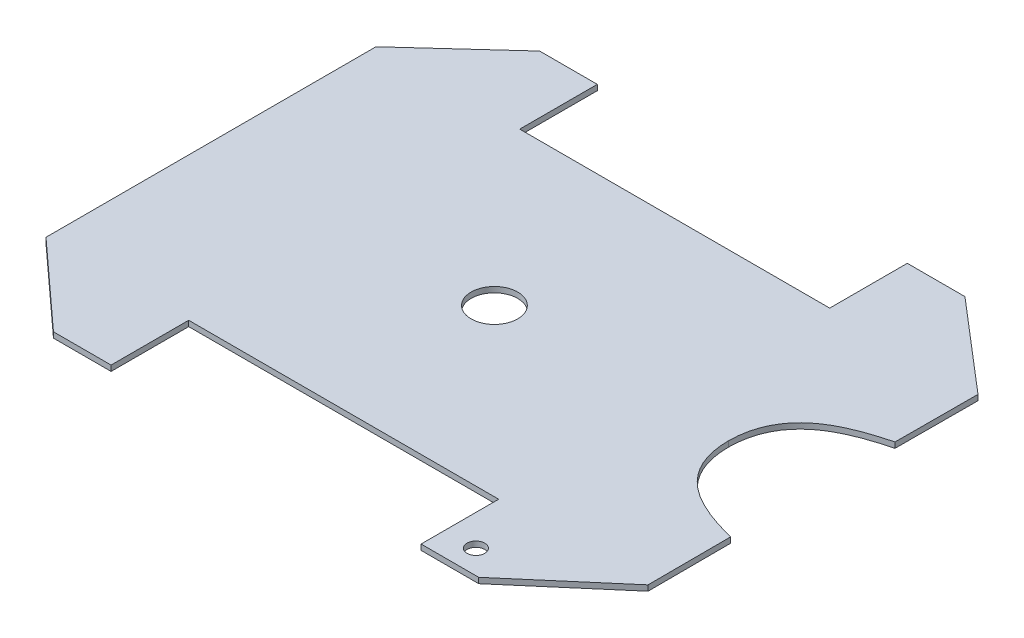
ISO-10303-21;
HEADER;
FILE_DESCRIPTION(('STEP AP214'),'2;1');
FILE_NAME('part.step','',(''),(''),'','','');
FILE_SCHEMA(('AUTOMOTIVE_DESIGN { 1 0 10303 214 1 1 1 1 }'));
ENDSEC;
DATA;
#1=APPLICATION_CONTEXT('core data for automotive mechanical design processes');
#2=APPLICATION_PROTOCOL_DEFINITION('international standard','automotive_design',2000,#1);
#3=PRODUCT_CONTEXT('',#1,'mechanical');
#4=PRODUCT('Part','Part','',(#3));
#5=PRODUCT_RELATED_PRODUCT_CATEGORY('part','',(#4));
#6=PRODUCT_DEFINITION_FORMATION('','',#4);
#7=PRODUCT_DEFINITION_CONTEXT('part definition',#1,'design');
#8=PRODUCT_DEFINITION('design','',#6,#7);
#9=PRODUCT_DEFINITION_SHAPE('','',#8);
#10=(LENGTH_UNIT() NAMED_UNIT(*) SI_UNIT(.MILLI.,.METRE.));
#11=(NAMED_UNIT(*) PLANE_ANGLE_UNIT() SI_UNIT($,.RADIAN.));
#12=(NAMED_UNIT(*) SI_UNIT($,.STERADIAN.) SOLID_ANGLE_UNIT());
#13=UNCERTAINTY_MEASURE_WITH_UNIT(LENGTH_MEASURE(1.E-05),#10,'distance_accuracy_value','');
#14=(GEOMETRIC_REPRESENTATION_CONTEXT(3) GLOBAL_UNCERTAINTY_ASSIGNED_CONTEXT((#13)) GLOBAL_UNIT_ASSIGNED_CONTEXT((#10,
#11,#12)) REPRESENTATION_CONTEXT('',''));
#15=CARTESIAN_POINT('',(0.,0.,0.));
#16=DIRECTION('',(0.,0.,1.));
#17=DIRECTION('',(1.,0.,0.));
#18=AXIS2_PLACEMENT_3D('',#15,#16,#17);
#19=CARTESIAN_POINT('',(273.101729513809,5.,148.382005757265));
#20=CARTESIAN_POINT('',(239.436641559966,5.,139.498513163197));
#21=CARTESIAN_POINT('',(197.437007814589,5.,124.72467079051));
#22=CARTESIAN_POINT('',(197.047353035714,5.,74.1756655702374));
#23=B_SPLINE_CURVE_WITH_KNOTS('',3,(#19,#20,#21,#22),.UNSPECIFIED.,.F.,.F.,(4,4),(0.,1.),.UNSPECIFIED.);
#24=DIRECTION('',(0.,-1.,0.));
#25=VECTOR('',#24,1.);
#26=SURFACE_OF_LINEAR_EXTRUSION('',#23,#25);
#27=CARTESIAN_POINT('',(273.101729513809,0.,148.382005757265));
#28=CARTESIAN_POINT('',(239.436641559966,0.,139.498513163197));
#29=CARTESIAN_POINT('',(197.437007814589,0.,124.72467079051));
#30=CARTESIAN_POINT('',(197.047353035714,0.,74.1756655702374));
#31=B_SPLINE_CURVE_WITH_KNOTS('',3,(#27,#28,#29,#30),.UNSPECIFIED.,.F.,.F.,(4,4),(0.,1.),.UNSPECIFIED.);
#32=CARTESIAN_POINT('',(273.101729513809,0.,148.382005757266));
#33=VERTEX_POINT('',#32);
#34=CARTESIAN_POINT('',(197.047353035714,0.,74.1756655702375));
#35=VERTEX_POINT('',#34);
#36=EDGE_CURVE('E196',#33,#35,#31,.T.);
#37=ORIENTED_EDGE('',*,*,#36,.T.);
#38=DIRECTION('',(0.,-1.,0.));
#39=VECTOR('',#38,1.);
#40=CARTESIAN_POINT('',(197.047353035714,5.,74.1756655702375));
#41=LINE('',#40,#39);
#42=CARTESIAN_POINT('',(197.047353035714,5.,74.1756655702375));
#43=VERTEX_POINT('',#42);
#44=EDGE_CURVE('E11',#43,#35,#41,.T.);
#45=ORIENTED_EDGE('',*,*,#44,.F.);
#46=CARTESIAN_POINT('',(273.101729513809,5.,148.382005757266));
#47=VERTEX_POINT('',#46);
#48=EDGE_CURVE('E243',#47,#43,#23,.T.);
#49=ORIENTED_EDGE('',*,*,#48,.F.);
#50=DIRECTION('',(0.,-1.,0.));
#51=VECTOR('',#50,1.);
#52=CARTESIAN_POINT('',(273.101729513809,5.,148.382005757266));
#53=LINE('',#52,#51);
#54=EDGE_CURVE('E192',#47,#33,#53,.T.);
#55=ORIENTED_EDGE('',*,*,#54,.T.);
#56=EDGE_LOOP('',(#37,#45,#49,#55));
#57=FACE_BOUND('',#56,.T.);
#58=ADVANCED_FACE('F33',(#57),#26,.F.);
#59=CARTESIAN_POINT('',(197.047353035714,5.,74.1756655702375));
#60=CARTESIAN_POINT('',(197.437007814589,5.,23.6266603499645));
#61=CARTESIAN_POINT('',(239.436641559966,5.,8.85281797727754));
#62=CARTESIAN_POINT('',(273.101729513809,5.,-0.0306746167901273));
#63=B_SPLINE_CURVE_WITH_KNOTS('',3,(#59,#60,#61,#62),.UNSPECIFIED.,.F.,.F.,(4,4),(0.,1.),.UNSPECIFIED.);
#64=DIRECTION('',(0.,-1.,0.));
#65=VECTOR('',#64,1.);
#66=SURFACE_OF_LINEAR_EXTRUSION('',#63,#65);
#67=CARTESIAN_POINT('',(197.047353035714,0.,74.1756655702375));
#68=CARTESIAN_POINT('',(197.437007814589,0.,23.6266603499645));
#69=CARTESIAN_POINT('',(239.436641559966,0.,8.85281797727754));
#70=CARTESIAN_POINT('',(273.101729513809,0.,-0.0306746167901273));
#71=B_SPLINE_CURVE_WITH_KNOTS('',3,(#67,#68,#69,#70),.UNSPECIFIED.,.F.,.F.,(4,4),(0.,1.),.UNSPECIFIED.);
#72=CARTESIAN_POINT('',(273.101729513809,0.,-0.0306746167908767));
#73=VERTEX_POINT('',#72);
#74=EDGE_CURVE('E201',#35,#73,#71,.T.);
#75=ORIENTED_EDGE('',*,*,#74,.T.);
#76=DIRECTION('',(0.,-1.,0.));
#77=VECTOR('',#76,1.);
#78=CARTESIAN_POINT('',(273.101729513809,5.,-0.0306746167908767));
#79=LINE('',#78,#77);
#80=CARTESIAN_POINT('',(273.101729513809,5.,-0.0306746167908767));
#81=VERTEX_POINT('',#80);
#82=EDGE_CURVE('E42',#81,#73,#79,.T.);
#83=ORIENTED_EDGE('',*,*,#82,.F.);
#84=EDGE_CURVE('E126',#43,#81,#63,.T.);
#85=ORIENTED_EDGE('',*,*,#84,.F.);
#86=ORIENTED_EDGE('',*,*,#44,.T.);
#87=EDGE_LOOP('',(#75,#83,#85,#86));
#88=FACE_BOUND('',#87,.T.);
#89=ADVANCED_FACE('F358',(#88),#66,.F.);
#90=CARTESIAN_POINT('',(273.341577688739,5.,-74.6606808376329));
#91=DIRECTION('',(-0.999994835687422,0.,-0.00321381369805612));
#92=DIRECTION('',(-0.00321381369805612,0.,0.999994835687422));
#93=AXIS2_PLACEMENT_3D('',#90,#91,#92);
#94=PLANE('',#93);
#95=DIRECTION('',(0.00321381369805612,0.,-0.999994835687422));
#96=VECTOR('',#95,1.);
#97=CARTESIAN_POINT('',(273.341577688739,0.,-74.6606808376329));
#98=LINE('',#97,#96);
#99=CARTESIAN_POINT('',(273.341577688739,0.,-74.6606808376329));
#100=VERTEX_POINT('',#99);
#101=EDGE_CURVE('E209',#73,#100,#98,.T.);
#102=ORIENTED_EDGE('',*,*,#101,.T.);
#103=DIRECTION('',(0.,-1.,0.));
#104=VECTOR('',#103,1.);
#105=CARTESIAN_POINT('',(273.341577688739,5.,-74.6606808376329));
#106=LINE('',#105,#104);
#107=CARTESIAN_POINT('',(273.341577688739,5.,-74.6606808376329));
#108=VERTEX_POINT('',#107);
#109=EDGE_CURVE('E283',#108,#100,#106,.T.);
#110=ORIENTED_EDGE('',*,*,#109,.F.);
#111=DIRECTION('',(0.00321381369805612,0.,-0.999994835687422));
#112=VECTOR('',#111,1.);
#113=CARTESIAN_POINT('',(273.341577688739,5.,-74.6606808376329));
#114=LINE('',#113,#112);
#115=EDGE_CURVE('E291',#81,#108,#114,.T.);
#116=ORIENTED_EDGE('',*,*,#115,.F.);
#117=ORIENTED_EDGE('',*,*,#82,.T.);
#118=EDGE_LOOP('',(#102,#110,#116,#117));
#119=FACE_BOUND('',#118,.T.);
#120=ADVANCED_FACE('F289',(#119),#94,.F.);
#121=CARTESIAN_POINT('',(273.341577688739,5.,-74.6606808376329));
#122=DIRECTION('',(-0.650583114259423,0.,0.759435060713232));
#123=DIRECTION('',(0.759435060713232,0.,0.650583114259423));
#124=AXIS2_PLACEMENT_3D('',#121,#122,#123);
#125=PLANE('',#124);
#126=DIRECTION('',(-0.759435060713232,0.,-0.650583114259423));
#127=VECTOR('',#126,1.);
#128=CARTESIAN_POINT('',(273.341577688739,0.,-74.6606808376329));
#129=LINE('',#128,#127);
#130=CARTESIAN_POINT('',(191.068300868454,0.,-145.141499307877));
#131=VERTEX_POINT('',#130);
#132=EDGE_CURVE('E214',#100,#131,#129,.T.);
#133=ORIENTED_EDGE('',*,*,#132,.T.);
#134=DIRECTION('',(0.,-1.,0.));
#135=VECTOR('',#134,1.);
#136=CARTESIAN_POINT('',(191.068300868454,5.,-145.141499307877));
#137=LINE('',#136,#135);
#138=CARTESIAN_POINT('',(191.068300868454,5.,-145.141499307877));
#139=VERTEX_POINT('',#138);
#140=EDGE_CURVE('E280',#139,#131,#137,.T.);
#141=ORIENTED_EDGE('',*,*,#140,.F.);
#142=DIRECTION('',(-0.759435060713232,0.,-0.650583114259423));
#143=VECTOR('',#142,1.);
#144=CARTESIAN_POINT('',(273.341577688739,5.,-74.6606808376329));
#145=LINE('',#144,#143);
#146=EDGE_CURVE('E309',#108,#139,#145,.T.);
#147=ORIENTED_EDGE('',*,*,#146,.F.);
#148=ORIENTED_EDGE('',*,*,#109,.T.);
#149=EDGE_LOOP('',(#133,#141,#147,#148));
#150=FACE_BOUND('',#149,.T.);
#151=ADVANCED_FACE('F300',(#150),#125,.F.);
#152=CARTESIAN_POINT('',(139.068300868454,5.,-145.141499307877));
#153=DIRECTION('',(0.,0.,1.));
#154=DIRECTION('',(1.,0.,0.));
#155=AXIS2_PLACEMENT_3D('',#152,#153,#154);
#156=PLANE('',#155);
#157=DIRECTION('',(-1.,0.,0.));
#158=VECTOR('',#157,1.);
#159=CARTESIAN_POINT('',(139.068300868454,0.,-145.141499307877));
#160=LINE('',#159,#158);
#161=CARTESIAN_POINT('',(139.068300868454,0.,-145.141499307877));
#162=VERTEX_POINT('',#161);
#163=EDGE_CURVE('E216',#131,#162,#160,.T.);
#164=ORIENTED_EDGE('',*,*,#163,.T.);
#165=DIRECTION('',(0.,-1.,0.));
#166=VECTOR('',#165,1.);
#167=CARTESIAN_POINT('',(139.068300868454,5.,-145.141499307877));
#168=LINE('',#167,#166);
#169=CARTESIAN_POINT('',(139.068300868454,5.,-145.141499307877));
#170=VERTEX_POINT('',#169);
#171=EDGE_CURVE('E277',#170,#162,#168,.T.);
#172=ORIENTED_EDGE('',*,*,#171,.F.);
#173=DIRECTION('',(-1.,0.,0.));
#174=VECTOR('',#173,1.);
#175=CARTESIAN_POINT('',(139.068300868454,5.,-145.141499307877));
#176=LINE('',#175,#174);
#177=EDGE_CURVE('E306',#139,#170,#176,.T.);
#178=ORIENTED_EDGE('',*,*,#177,.F.);
#179=ORIENTED_EDGE('',*,*,#140,.T.);
#180=EDGE_LOOP('',(#164,#172,#178,#179));
#181=FACE_BOUND('',#180,.T.);
#182=ADVANCED_FACE('F304',(#181),#156,.F.);
#183=CARTESIAN_POINT('',(139.068300868454,5.,-75.1414993078773));
#184=DIRECTION('',(1.,0.,0.));
#185=DIRECTION('',(0.,0.,-1.));
#186=AXIS2_PLACEMENT_3D('',#183,#184,#185);
#187=PLANE('',#186);
#188=DIRECTION('',(0.,0.,1.));
#189=VECTOR('',#188,1.);
#190=CARTESIAN_POINT('',(139.068300868454,0.,-75.1414993078773));
#191=LINE('',#190,#189);
#192=CARTESIAN_POINT('',(139.068300868454,0.,-75.1414993078773));
#193=VERTEX_POINT('',#192);
#194=EDGE_CURVE('E218',#162,#193,#191,.T.);
#195=ORIENTED_EDGE('',*,*,#194,.T.);
#196=DIRECTION('',(0.,-1.,0.));
#197=VECTOR('',#196,1.);
#198=CARTESIAN_POINT('',(139.068300868454,5.,-75.1414993078773));
#199=LINE('',#198,#197);
#200=CARTESIAN_POINT('',(139.068300868454,5.,-75.1414993078773));
#201=VERTEX_POINT('',#200);
#202=EDGE_CURVE('E274',#201,#193,#199,.T.);
#203=ORIENTED_EDGE('',*,*,#202,.F.);
#204=DIRECTION('',(0.,0.,1.));
#205=VECTOR('',#204,1.);
#206=CARTESIAN_POINT('',(139.068300868454,5.,-75.1414993078773));
#207=LINE('',#206,#205);
#208=EDGE_CURVE('E308',#170,#201,#207,.T.);
#209=ORIENTED_EDGE('',*,*,#208,.F.);
#210=ORIENTED_EDGE('',*,*,#171,.T.);
#211=EDGE_LOOP('',(#195,#203,#209,#210));
#212=FACE_BOUND('',#211,.T.);
#213=ADVANCED_FACE('F532',(#212),#187,.F.);
#214=CARTESIAN_POINT('',(-140.586469874335,5.,-75.1414993078773));
#215=DIRECTION('',(0.,0.,1.));
#216=DIRECTION('',(1.,0.,0.));
#217=AXIS2_PLACEMENT_3D('',#214,#215,#216);
#218=PLANE('',#217);
#219=DIRECTION('',(-1.,0.,0.));
#220=VECTOR('',#219,1.);
#221=CARTESIAN_POINT('',(-140.586469874335,0.,-75.1414993078773));
#222=LINE('',#221,#220);
#223=CARTESIAN_POINT('',(-140.586469874335,0.,-75.1414993078773));
#224=VERTEX_POINT('',#223);
#225=EDGE_CURVE('E220',#193,#224,#222,.T.);
#226=ORIENTED_EDGE('',*,*,#225,.T.);
#227=DIRECTION('',(0.,-1.,0.));
#228=VECTOR('',#227,1.);
#229=CARTESIAN_POINT('',(-140.586469874335,5.,-75.1414993078773));
#230=LINE('',#229,#228);
#231=CARTESIAN_POINT('',(-140.586469874335,5.,-75.1414993078773));
#232=VERTEX_POINT('',#231);
#233=EDGE_CURVE('E271',#232,#224,#230,.T.);
#234=ORIENTED_EDGE('',*,*,#233,.F.);
#235=DIRECTION('',(-1.,0.,0.));
#236=VECTOR('',#235,1.);
#237=CARTESIAN_POINT('',(-140.586469874335,5.,-75.1414993078773));
#238=LINE('',#237,#236);
#239=EDGE_CURVE('E311',#201,#232,#238,.T.);
#240=ORIENTED_EDGE('',*,*,#239,.F.);
#241=ORIENTED_EDGE('',*,*,#202,.T.);
#242=EDGE_LOOP('',(#226,#234,#240,#241));
#243=FACE_BOUND('',#242,.T.);
#244=ADVANCED_FACE('F523',(#243),#218,.F.);
#245=CARTESIAN_POINT('',(-140.586469874335,5.,-75.1414993078773));
#246=DIRECTION('',(-1.,0.,0.));
#247=DIRECTION('',(0.,0.,1.));
#248=AXIS2_PLACEMENT_3D('',#245,#246,#247);
#249=PLANE('',#248);
#250=DIRECTION('',(0.,0.,-1.));
#251=VECTOR('',#250,1.);
#252=CARTESIAN_POINT('',(-140.586469874335,0.,-75.1414993078773));
#253=LINE('',#252,#251);
#254=CARTESIAN_POINT('',(-140.586469874335,0.,-145.141499307877));
#255=VERTEX_POINT('',#254);
#256=EDGE_CURVE('E222',#224,#255,#253,.T.);
#257=ORIENTED_EDGE('',*,*,#256,.T.);
#258=DIRECTION('',(0.,-1.,0.));
#259=VECTOR('',#258,1.);
#260=CARTESIAN_POINT('',(-140.586469874335,5.,-145.141499307877));
#261=LINE('',#260,#259);
#262=CARTESIAN_POINT('',(-140.586469874335,5.,-145.141499307877));
#263=VERTEX_POINT('',#262);
#264=EDGE_CURVE('E268',#263,#255,#261,.T.);
#265=ORIENTED_EDGE('',*,*,#264,.F.);
#266=DIRECTION('',(0.,0.,-1.));
#267=VECTOR('',#266,1.);
#268=CARTESIAN_POINT('',(-140.586469874335,5.,-75.1414993078773));
#269=LINE('',#268,#267);
#270=EDGE_CURVE('E317',#232,#263,#269,.T.);
#271=ORIENTED_EDGE('',*,*,#270,.F.);
#272=ORIENTED_EDGE('',*,*,#233,.T.);
#273=EDGE_LOOP('',(#257,#265,#271,#272));
#274=FACE_BOUND('',#273,.T.);
#275=ADVANCED_FACE('F514',(#274),#249,.F.);
#276=CARTESIAN_POINT('',(-140.586469874335,5.,-145.141499307877));
#277=DIRECTION('',(0.,0.,1.));
#278=DIRECTION('',(1.,0.,0.));
#279=AXIS2_PLACEMENT_3D('',#276,#277,#278);
#280=PLANE('',#279);
#281=DIRECTION('',(-1.,0.,0.));
#282=VECTOR('',#281,1.);
#283=CARTESIAN_POINT('',(-140.586469874335,0.,-145.141499307877));
#284=LINE('',#283,#282);
#285=CARTESIAN_POINT('',(-192.586469874335,0.,-145.141499307877));
#286=VERTEX_POINT('',#285);
#287=EDGE_CURVE('E224',#255,#286,#284,.T.);
#288=ORIENTED_EDGE('',*,*,#287,.T.);
#289=DIRECTION('',(0.,-1.,0.));
#290=VECTOR('',#289,1.);
#291=CARTESIAN_POINT('',(-192.586469874335,5.,-145.141499307877));
#292=LINE('',#291,#290);
#293=CARTESIAN_POINT('',(-192.586469874335,5.,-145.141499307877));
#294=VERTEX_POINT('',#293);
#295=EDGE_CURVE('E265',#294,#286,#292,.T.);
#296=ORIENTED_EDGE('',*,*,#295,.F.);
#297=DIRECTION('',(-1.,0.,0.));
#298=VECTOR('',#297,1.);
#299=CARTESIAN_POINT('',(-140.586469874335,5.,-145.141499307877));
#300=LINE('',#299,#298);
#301=EDGE_CURVE('E319',#263,#294,#300,.T.);
#302=ORIENTED_EDGE('',*,*,#301,.F.);
#303=ORIENTED_EDGE('',*,*,#264,.T.);
#304=EDGE_LOOP('',(#288,#296,#302,#303));
#305=FACE_BOUND('',#304,.T.);
#306=ADVANCED_FACE('F505',(#305),#280,.F.);
#307=CARTESIAN_POINT('',(-269.792181600452,5.,-74.6606808376328));
#308=DIRECTION('',(0.674210134413065,0.,0.738539568780655));
#309=DIRECTION('',(0.738539568780655,0.,-0.674210134413065));
#310=AXIS2_PLACEMENT_3D('',#307,#308,#309);
#311=PLANE('',#310);
#312=DIRECTION('',(-0.738539568780655,0.,0.674210134413065));
#313=VECTOR('',#312,1.);
#314=CARTESIAN_POINT('',(-269.792181600452,0.,-74.6606808376328));
#315=LINE('',#314,#313);
#316=CARTESIAN_POINT('',(-269.792181600452,0.,-74.6606808376328));
#317=VERTEX_POINT('',#316);
#318=EDGE_CURVE('E226',#286,#317,#315,.T.);
#319=ORIENTED_EDGE('',*,*,#318,.T.);
#320=DIRECTION('',(0.,-1.,0.));
#321=VECTOR('',#320,1.);
#322=CARTESIAN_POINT('',(-269.792181600452,5.,-74.6606808376328));
#323=LINE('',#322,#321);
#324=CARTESIAN_POINT('',(-269.792181600452,5.,-74.6606808376328));
#325=VERTEX_POINT('',#324);
#326=EDGE_CURVE('E262',#325,#317,#323,.T.);
#327=ORIENTED_EDGE('',*,*,#326,.F.);
#328=DIRECTION('',(-0.738539568780655,0.,0.674210134413065));
#329=VECTOR('',#328,1.);
#330=CARTESIAN_POINT('',(-269.792181600452,5.,-74.6606808376328));
#331=LINE('',#330,#329);
#332=EDGE_CURVE('E321',#294,#325,#331,.T.);
#333=ORIENTED_EDGE('',*,*,#332,.F.);
#334=ORIENTED_EDGE('',*,*,#295,.T.);
#335=EDGE_LOOP('',(#319,#327,#333,#334));
#336=FACE_BOUND('',#335,.T.);
#337=ADVANCED_FACE('F496',(#336),#311,.F.);
#338=CARTESIAN_POINT('',(-269.792181600452,5.,-74.6606808376328));
#339=DIRECTION('',(1.,0.,0.));
#340=DIRECTION('',(0.,0.,-1.));
#341=AXIS2_PLACEMENT_3D('',#338,#339,#340);
#342=PLANE('',#341);
#343=DIRECTION('',(0.,0.,1.));
#344=VECTOR('',#343,1.);
#345=CARTESIAN_POINT('',(-269.792181600452,0.,-74.6606808376328));
#346=LINE('',#345,#344);
#347=CARTESIAN_POINT('',(-269.792181600452,0.,223.012011978108));
#348=VERTEX_POINT('',#347);
#349=EDGE_CURVE('E228',#317,#348,#346,.T.);
#350=ORIENTED_EDGE('',*,*,#349,.T.);
#351=DIRECTION('',(0.,-1.,0.));
#352=VECTOR('',#351,1.);
#353=CARTESIAN_POINT('',(-269.792181600452,5.,223.012011978108));
#354=LINE('',#353,#352);
#355=CARTESIAN_POINT('',(-269.792181600452,5.,223.012011978108));
#356=VERTEX_POINT('',#355);
#357=EDGE_CURVE('E259',#356,#348,#354,.T.);
#358=ORIENTED_EDGE('',*,*,#357,.F.);
#359=DIRECTION('',(0.,0.,1.));
#360=VECTOR('',#359,1.);
#361=CARTESIAN_POINT('',(-269.792181600452,5.,-74.6606808376328));
#362=LINE('',#361,#360);
#363=EDGE_CURVE('E323',#325,#356,#362,.T.);
#364=ORIENTED_EDGE('',*,*,#363,.F.);
#365=ORIENTED_EDGE('',*,*,#326,.T.);
#366=EDGE_LOOP('',(#350,#358,#364,#365));
#367=FACE_BOUND('',#366,.T.);
#368=ADVANCED_FACE('F487',(#367),#342,.F.);
#369=CARTESIAN_POINT('',(-269.792181600452,5.,223.012011978108));
#370=DIRECTION('',(0.674210134413065,0.,-0.738539568780655));
#371=DIRECTION('',(-0.738539568780655,0.,-0.674210134413065));
#372=AXIS2_PLACEMENT_3D('',#369,#370,#371);
#373=PLANE('',#372);
#374=DIRECTION('',(0.738539568780655,0.,0.674210134413065));
#375=VECTOR('',#374,1.);
#376=CARTESIAN_POINT('',(-269.792181600452,0.,223.012011978108));
#377=LINE('',#376,#375);
#378=CARTESIAN_POINT('',(-192.586469874335,0.,293.492830448352));
#379=VERTEX_POINT('',#378);
#380=EDGE_CURVE('E230',#348,#379,#377,.T.);
#381=ORIENTED_EDGE('',*,*,#380,.T.);
#382=DIRECTION('',(0.,-1.,0.));
#383=VECTOR('',#382,1.);
#384=CARTESIAN_POINT('',(-192.586469874335,5.,293.492830448352));
#385=LINE('',#384,#383);
#386=CARTESIAN_POINT('',(-192.586469874335,5.,293.492830448352));
#387=VERTEX_POINT('',#386);
#388=EDGE_CURVE('E256',#387,#379,#385,.T.);
#389=ORIENTED_EDGE('',*,*,#388,.F.);
#390=DIRECTION('',(0.738539568780655,0.,0.674210134413065));
#391=VECTOR('',#390,1.);
#392=CARTESIAN_POINT('',(-269.792181600452,5.,223.012011978108));
#393=LINE('',#392,#391);
#394=EDGE_CURVE('E325',#356,#387,#393,.T.);
#395=ORIENTED_EDGE('',*,*,#394,.F.);
#396=ORIENTED_EDGE('',*,*,#357,.T.);
#397=EDGE_LOOP('',(#381,#389,#395,#396));
#398=FACE_BOUND('',#397,.T.);
#399=ADVANCED_FACE('F478',(#398),#373,.F.);
#400=CARTESIAN_POINT('',(-140.586469874335,5.,293.492830448352));
#401=DIRECTION('',(0.,0.,-1.));
#402=DIRECTION('',(-1.,0.,0.));
#403=AXIS2_PLACEMENT_3D('',#400,#401,#402);
#404=PLANE('',#403);
#405=DIRECTION('',(1.,0.,0.));
#406=VECTOR('',#405,1.);
#407=CARTESIAN_POINT('',(-140.586469874335,0.,293.492830448352));
#408=LINE('',#407,#406);
#409=CARTESIAN_POINT('',(-140.586469874335,0.,293.492830448352));
#410=VERTEX_POINT('',#409);
#411=EDGE_CURVE('E232',#379,#410,#408,.T.);
#412=ORIENTED_EDGE('',*,*,#411,.T.);
#413=DIRECTION('',(0.,-1.,0.));
#414=VECTOR('',#413,1.);
#415=CARTESIAN_POINT('',(-140.586469874335,5.,293.492830448352));
#416=LINE('',#415,#414);
#417=CARTESIAN_POINT('',(-140.586469874335,5.,293.492830448352));
#418=VERTEX_POINT('',#417);
#419=EDGE_CURVE('E253',#418,#410,#416,.T.);
#420=ORIENTED_EDGE('',*,*,#419,.F.);
#421=DIRECTION('',(1.,0.,0.));
#422=VECTOR('',#421,1.);
#423=CARTESIAN_POINT('',(-140.586469874335,5.,293.492830448352));
#424=LINE('',#423,#422);
#425=EDGE_CURVE('E327',#387,#418,#424,.T.);
#426=ORIENTED_EDGE('',*,*,#425,.F.);
#427=ORIENTED_EDGE('',*,*,#388,.T.);
#428=EDGE_LOOP('',(#412,#420,#426,#427));
#429=FACE_BOUND('',#428,.T.);
#430=ADVANCED_FACE('F469',(#429),#404,.F.);
#431=CARTESIAN_POINT('',(-140.586469874335,5.,223.492830448352));
#432=DIRECTION('',(-1.,0.,0.));
#433=DIRECTION('',(0.,0.,1.));
#434=AXIS2_PLACEMENT_3D('',#431,#432,#433);
#435=PLANE('',#434);
#436=DIRECTION('',(0.,0.,-1.));
#437=VECTOR('',#436,1.);
#438=CARTESIAN_POINT('',(-140.586469874335,0.,223.492830448352));
#439=LINE('',#438,#437);
#440=CARTESIAN_POINT('',(-140.586469874335,0.,223.492830448352));
#441=VERTEX_POINT('',#440);
#442=EDGE_CURVE('E234',#410,#441,#439,.T.);
#443=ORIENTED_EDGE('',*,*,#442,.T.);
#444=DIRECTION('',(0.,-1.,0.));
#445=VECTOR('',#444,1.);
#446=CARTESIAN_POINT('',(-140.586469874335,5.,223.492830448352));
#447=LINE('',#446,#445);
#448=CARTESIAN_POINT('',(-140.586469874335,5.,223.492830448352));
#449=VERTEX_POINT('',#448);
#450=EDGE_CURVE('E250',#449,#441,#447,.T.);
#451=ORIENTED_EDGE('',*,*,#450,.F.);
#452=DIRECTION('',(0.,0.,-1.));
#453=VECTOR('',#452,1.);
#454=CARTESIAN_POINT('',(-140.586469874335,5.,223.492830448352));
#455=LINE('',#454,#453);
#456=EDGE_CURVE('E329',#418,#449,#455,.T.);
#457=ORIENTED_EDGE('',*,*,#456,.F.);
#458=ORIENTED_EDGE('',*,*,#419,.T.);
#459=EDGE_LOOP('',(#443,#451,#457,#458));
#460=FACE_BOUND('',#459,.T.);
#461=ADVANCED_FACE('F461',(#460),#435,.F.);
#462=CARTESIAN_POINT('',(-140.586469874335,5.,223.492830448352));
#463=DIRECTION('',(0.,0.,-1.));
#464=DIRECTION('',(-1.,0.,0.));
#465=AXIS2_PLACEMENT_3D('',#462,#463,#464);
#466=PLANE('',#465);
#467=DIRECTION('',(1.,0.,0.));
#468=VECTOR('',#467,1.);
#469=CARTESIAN_POINT('',(-140.586469874335,0.,223.492830448352));
#470=LINE('',#469,#468);
#471=CARTESIAN_POINT('',(139.068300868454,0.,223.492830448352));
#472=VERTEX_POINT('',#471);
#473=EDGE_CURVE('E236',#441,#472,#470,.T.);
#474=ORIENTED_EDGE('',*,*,#473,.T.);
#475=DIRECTION('',(0.,-1.,0.));
#476=VECTOR('',#475,1.);
#477=CARTESIAN_POINT('',(139.068300868454,5.,223.492830448352));
#478=LINE('',#477,#476);
#479=CARTESIAN_POINT('',(139.068300868454,5.,223.492830448352));
#480=VERTEX_POINT('',#479);
#481=EDGE_CURVE('E247',#480,#472,#478,.T.);
#482=ORIENTED_EDGE('',*,*,#481,.F.);
#483=DIRECTION('',(1.,0.,0.));
#484=VECTOR('',#483,1.);
#485=CARTESIAN_POINT('',(-140.586469874335,5.,223.492830448352));
#486=LINE('',#485,#484);
#487=EDGE_CURVE('E331',#449,#480,#486,.T.);
#488=ORIENTED_EDGE('',*,*,#487,.F.);
#489=ORIENTED_EDGE('',*,*,#450,.T.);
#490=EDGE_LOOP('',(#474,#482,#488,#489));
#491=FACE_BOUND('',#490,.T.);
#492=ADVANCED_FACE('F337',(#491),#466,.F.);
#493=CARTESIAN_POINT('',(139.068300868454,5.,223.492830448352));
#494=DIRECTION('',(1.,0.,0.));
#495=DIRECTION('',(0.,0.,-1.));
#496=AXIS2_PLACEMENT_3D('',#493,#494,#495);
#497=PLANE('',#496);
#498=DIRECTION('',(0.,0.,1.));
#499=VECTOR('',#498,1.);
#500=CARTESIAN_POINT('',(139.068300868454,0.,223.492830448352));
#501=LINE('',#500,#499);
#502=CARTESIAN_POINT('',(139.068300868454,0.,293.492830448352));
#503=VERTEX_POINT('',#502);
#504=EDGE_CURVE('E238',#472,#503,#501,.T.);
#505=ORIENTED_EDGE('',*,*,#504,.T.);
#506=DIRECTION('',(0.,-1.,0.));
#507=VECTOR('',#506,1.);
#508=CARTESIAN_POINT('',(139.068300868454,5.,293.492830448352));
#509=LINE('',#508,#507);
#510=CARTESIAN_POINT('',(139.068300868454,5.,293.492830448352));
#511=VERTEX_POINT('',#510);
#512=EDGE_CURVE('E187',#511,#503,#509,.T.);
#513=ORIENTED_EDGE('',*,*,#512,.F.);
#514=DIRECTION('',(0.,0.,1.));
#515=VECTOR('',#514,1.);
#516=CARTESIAN_POINT('',(139.068300868454,5.,223.492830448352));
#517=LINE('',#516,#515);
#518=EDGE_CURVE('E178',#480,#511,#517,.T.);
#519=ORIENTED_EDGE('',*,*,#518,.F.);
#520=ORIENTED_EDGE('',*,*,#481,.T.);
#521=EDGE_LOOP('',(#505,#513,#519,#520));
#522=FACE_BOUND('',#521,.T.);
#523=ADVANCED_FACE('F341',(#522),#497,.F.);
#524=CARTESIAN_POINT('',(139.068300868454,5.,293.492830448352));
#525=DIRECTION('',(0.,0.,-1.));
#526=DIRECTION('',(-1.,0.,0.));
#527=AXIS2_PLACEMENT_3D('',#524,#525,#526);
#528=PLANE('',#527);
#529=DIRECTION('',(1.,0.,0.));
#530=VECTOR('',#529,1.);
#531=CARTESIAN_POINT('',(139.068300868454,0.,293.492830448352));
#532=LINE('',#531,#530);
#533=CARTESIAN_POINT('',(191.068300868454,0.,293.492830448352));
#534=VERTEX_POINT('',#533);
#535=EDGE_CURVE('E186',#503,#534,#532,.T.);
#536=ORIENTED_EDGE('',*,*,#535,.T.);
#537=DIRECTION('',(0.,-1.,0.));
#538=VECTOR('',#537,1.);
#539=CARTESIAN_POINT('',(191.068300868454,5.,293.492830448352));
#540=LINE('',#539,#538);
#541=CARTESIAN_POINT('',(191.068300868454,5.,293.492830448352));
#542=VERTEX_POINT('',#541);
#543=EDGE_CURVE('E183',#542,#534,#540,.T.);
#544=ORIENTED_EDGE('',*,*,#543,.F.);
#545=DIRECTION('',(1.,0.,0.));
#546=VECTOR('',#545,1.);
#547=CARTESIAN_POINT('',(139.068300868454,5.,293.492830448352));
#548=LINE('',#547,#546);
#549=EDGE_CURVE('E172',#511,#542,#548,.T.);
#550=ORIENTED_EDGE('',*,*,#549,.F.);
#551=ORIENTED_EDGE('',*,*,#512,.T.);
#552=EDGE_LOOP('',(#536,#544,#550,#551));
#553=FACE_BOUND('',#552,.T.);
#554=ADVANCED_FACE('F184',(#553),#528,.F.);
#555=CARTESIAN_POINT('',(273.341577688739,5.,223.012011978108));
#556=DIRECTION('',(-0.650583114259423,0.,-0.759435060713232));
#557=DIRECTION('',(-0.759435060713232,0.,0.650583114259423));
#558=AXIS2_PLACEMENT_3D('',#555,#556,#557);
#559=PLANE('',#558);
#560=DIRECTION('',(0.759435060713232,0.,-0.650583114259423));
#561=VECTOR('',#560,1.);
#562=CARTESIAN_POINT('',(273.341577688739,0.,223.012011978108));
#563=LINE('',#562,#561);
#564=CARTESIAN_POINT('',(273.341577688739,0.,223.012011978108));
#565=VERTEX_POINT('',#564);
#566=EDGE_CURVE('E112',#534,#565,#563,.T.);
#567=ORIENTED_EDGE('',*,*,#566,.T.);
#568=DIRECTION('',(0.,-1.,0.));
#569=VECTOR('',#568,1.);
#570=CARTESIAN_POINT('',(273.341577688739,5.,223.012011978108));
#571=LINE('',#570,#569);
#572=CARTESIAN_POINT('',(273.341577688739,5.,223.012011978108));
#573=VERTEX_POINT('',#572);
#574=EDGE_CURVE('E188',#573,#565,#571,.T.);
#575=ORIENTED_EDGE('',*,*,#574,.F.);
#576=DIRECTION('',(0.759435060713232,0.,-0.650583114259423));
#577=VECTOR('',#576,1.);
#578=CARTESIAN_POINT('',(273.341577688739,5.,223.012011978108));
#579=LINE('',#578,#577);
#580=EDGE_CURVE('E176',#542,#573,#579,.T.);
#581=ORIENTED_EDGE('',*,*,#580,.F.);
#582=ORIENTED_EDGE('',*,*,#543,.T.);
#583=EDGE_LOOP('',(#567,#575,#581,#582));
#584=FACE_BOUND('',#583,.T.);
#585=ADVANCED_FACE('F190',(#584),#559,.F.);
#586=CARTESIAN_POINT('',(273.341577688739,5.,223.012011978108));
#587=DIRECTION('',(-0.999994835687422,0.,0.00321381369805613));
#588=DIRECTION('',(0.00321381369805613,0.,0.999994835687422));
#589=AXIS2_PLACEMENT_3D('',#586,#587,#588);
#590=PLANE('',#589);
#591=DIRECTION('',(-0.00321381369805613,0.,-0.999994835687422));
#592=VECTOR('',#591,1.);
#593=CARTESIAN_POINT('',(273.341577688739,0.,223.012011978108));
#594=LINE('',#593,#592);
#595=EDGE_CURVE('E118',#565,#33,#594,.T.);
#596=ORIENTED_EDGE('',*,*,#595,.T.);
#597=ORIENTED_EDGE('',*,*,#54,.F.);
#598=DIRECTION('',(-0.00321381369805613,0.,-0.999994835687422));
#599=VECTOR('',#598,1.);
#600=CARTESIAN_POINT('',(273.341577688739,5.,223.012011978108));
#601=LINE('',#600,#599);
#602=EDGE_CURVE('E50',#573,#47,#601,.T.);
#603=ORIENTED_EDGE('',*,*,#602,.F.);
#604=ORIENTED_EDGE('',*,*,#574,.T.);
#605=EDGE_LOOP('',(#596,#597,#603,#604));
#606=FACE_BOUND('',#605,.T.);
#607=ADVANCED_FACE('F345',(#606),#590,.F.);
#608=CARTESIAN_POINT('',(222.596253834149,5.,126.903402898578));
#609=DIRECTION('',(0.,1.,0.));
#610=DIRECTION('',(0.,0.,1.));
#611=AXIS2_PLACEMENT_3D('',#608,#609,#610);
#612=PLANE('',#611);
#613=CARTESIAN_POINT('',(167.052967515773,5.,272.065876513803));
#614=DIRECTION('',(0.,1.,0.));
#615=DIRECTION('',(0.,0.,1.));
#616=AXIS2_PLACEMENT_3D('',#613,#614,#615);
#617=CIRCLE('',#616,8.00000000000001);
#618=CARTESIAN_POINT('',(167.052967515773,5.,280.065876513803));
#619=VERTEX_POINT('',#618);
#620=EDGE_CURVE('E387',#619,#619,#617,.T.);
#621=ORIENTED_EDGE('',*,*,#620,.F.);
#622=EDGE_LOOP('',(#621));
#623=FACE_BOUND('',#622,.T.);
#624=CARTESIAN_POINT('',(-14.2299509116979,5.,74.0266572541699));
#625=DIRECTION('',(0.,1.,0.));
#626=DIRECTION('',(0.,0.,1.));
#627=AXIS2_PLACEMENT_3D('',#624,#625,#626);
#628=CIRCLE('',#627,21.);
#629=CARTESIAN_POINT('',(-14.2299509116979,5.,95.0266572541699));
#630=VERTEX_POINT('',#629);
#631=EDGE_CURVE('E378',#630,#630,#628,.T.);
#632=ORIENTED_EDGE('',*,*,#631,.F.);
#633=EDGE_LOOP('',(#632));
#634=FACE_BOUND('',#633,.T.);
#635=ORIENTED_EDGE('',*,*,#48,.T.);
#636=ORIENTED_EDGE('',*,*,#84,.T.);
#637=ORIENTED_EDGE('',*,*,#115,.T.);
#638=ORIENTED_EDGE('',*,*,#146,.T.);
#639=ORIENTED_EDGE('',*,*,#177,.T.);
#640=ORIENTED_EDGE('',*,*,#208,.T.);
#641=ORIENTED_EDGE('',*,*,#239,.T.);
#642=ORIENTED_EDGE('',*,*,#270,.T.);
#643=ORIENTED_EDGE('',*,*,#301,.T.);
#644=ORIENTED_EDGE('',*,*,#332,.T.);
#645=ORIENTED_EDGE('',*,*,#363,.T.);
#646=ORIENTED_EDGE('',*,*,#394,.T.);
#647=ORIENTED_EDGE('',*,*,#425,.T.);
#648=ORIENTED_EDGE('',*,*,#456,.T.);
#649=ORIENTED_EDGE('',*,*,#487,.T.);
#650=ORIENTED_EDGE('',*,*,#518,.T.);
#651=ORIENTED_EDGE('',*,*,#549,.T.);
#652=ORIENTED_EDGE('',*,*,#580,.T.);
#653=ORIENTED_EDGE('',*,*,#602,.T.);
#654=EDGE_LOOP('',(#635,#636,#637,#638,#639,#640,#641,#642,#643,#644,#645,#646,#647,#648,#649,
#650,#651,#652,#653));
#655=FACE_BOUND('',#654,.T.);
#656=ADVANCED_FACE('F174',(#623,#634,#655),#612,.T.);
#657=CARTESIAN_POINT('',(222.596253834149,0.,126.903402898578));
#658=DIRECTION('',(0.,1.,0.));
#659=DIRECTION('',(0.,0.,1.));
#660=AXIS2_PLACEMENT_3D('',#657,#658,#659);
#661=PLANE('',#660);
#662=CARTESIAN_POINT('',(167.052967515773,0.,272.065876513803));
#663=DIRECTION('',(0.,1.,0.));
#664=DIRECTION('',(0.,0.,1.));
#665=AXIS2_PLACEMENT_3D('',#662,#663,#664);
#666=CIRCLE('',#665,8.00000000000001);
#667=CARTESIAN_POINT('',(167.052967515773,0.,280.065876513803));
#668=VERTEX_POINT('',#667);
#669=EDGE_CURVE('E384',#668,#668,#666,.T.);
#670=ORIENTED_EDGE('',*,*,#669,.T.);
#671=EDGE_LOOP('',(#670));
#672=FACE_BOUND('',#671,.T.);
#673=CARTESIAN_POINT('',(-14.2299509116979,0.,74.0266572541699));
#674=DIRECTION('',(0.,1.,0.));
#675=DIRECTION('',(0.,0.,1.));
#676=AXIS2_PLACEMENT_3D('',#673,#674,#675);
#677=CIRCLE('',#676,21.);
#678=CARTESIAN_POINT('',(-14.2299509116979,0.,95.0266572541699));
#679=VERTEX_POINT('',#678);
#680=EDGE_CURVE('E202',#679,#679,#677,.T.);
#681=ORIENTED_EDGE('',*,*,#680,.T.);
#682=EDGE_LOOP('',(#681));
#683=FACE_BOUND('',#682,.T.);
#684=ORIENTED_EDGE('',*,*,#36,.F.);
#685=ORIENTED_EDGE('',*,*,#595,.F.);
#686=ORIENTED_EDGE('',*,*,#566,.F.);
#687=ORIENTED_EDGE('',*,*,#535,.F.);
#688=ORIENTED_EDGE('',*,*,#504,.F.);
#689=ORIENTED_EDGE('',*,*,#473,.F.);
#690=ORIENTED_EDGE('',*,*,#442,.F.);
#691=ORIENTED_EDGE('',*,*,#411,.F.);
#692=ORIENTED_EDGE('',*,*,#380,.F.);
#693=ORIENTED_EDGE('',*,*,#349,.F.);
#694=ORIENTED_EDGE('',*,*,#318,.F.);
#695=ORIENTED_EDGE('',*,*,#287,.F.);
#696=ORIENTED_EDGE('',*,*,#256,.F.);
#697=ORIENTED_EDGE('',*,*,#225,.F.);
#698=ORIENTED_EDGE('',*,*,#194,.F.);
#699=ORIENTED_EDGE('',*,*,#163,.F.);
#700=ORIENTED_EDGE('',*,*,#132,.F.);
#701=ORIENTED_EDGE('',*,*,#101,.F.);
#702=ORIENTED_EDGE('',*,*,#74,.F.);
#703=EDGE_LOOP('',(#684,#685,#686,#687,#688,#689,#690,#691,#692,#693,#694,#695,#696,#697,#698,
#699,#700,#701,#702));
#704=FACE_BOUND('',#703,.T.);
#705=ADVANCED_FACE('F295',(#672,#683,#704),#661,.F.);
#706=CARTESIAN_POINT('',(-14.2299509116979,0.,74.0266572541699));
#707=DIRECTION('',(0.,1.,0.));
#708=DIRECTION('',(0.,0.,1.));
#709=AXIS2_PLACEMENT_3D('',#706,#707,#708);
#710=CYLINDRICAL_SURFACE('',#709,21.);
#711=ORIENTED_EDGE('',*,*,#680,.F.);
#712=EDGE_LOOP('',(#711));
#713=FACE_BOUND('',#712,.T.);
#714=ORIENTED_EDGE('',*,*,#631,.T.);
#715=EDGE_LOOP('',(#714));
#716=FACE_BOUND('',#715,.T.);
#717=ADVANCED_FACE('F398',(#713,#716),#710,.F.);
#718=CARTESIAN_POINT('',(167.052967515773,0.,272.065876513803));
#719=DIRECTION('',(0.,1.,0.));
#720=DIRECTION('',(0.,0.,1.));
#721=AXIS2_PLACEMENT_3D('',#718,#719,#720);
#722=CYLINDRICAL_SURFACE('',#721,8.00000000000001);
#723=ORIENTED_EDGE('',*,*,#669,.F.);
#724=EDGE_LOOP('',(#723));
#725=FACE_BOUND('',#724,.T.);
#726=ORIENTED_EDGE('',*,*,#620,.T.);
#727=EDGE_LOOP('',(#726));
#728=FACE_BOUND('',#727,.T.);
#729=ADVANCED_FACE('F395',(#725,#728),#722,.F.);
#730=CLOSED_SHELL('',(#58,#89,#120,#151,#182,#213,#244,#275,#306,#337,#368,#399,#430,#461,#492,
#523,#554,#585,#607,#656,#705,#717,#729));
#731=MANIFOLD_SOLID_BREP('B2',#730);
#732=ADVANCED_BREP_SHAPE_REPRESENTATION('',(#18,#731),#14);
#733=SHAPE_DEFINITION_REPRESENTATION(#9,#732);
ENDSEC;
END-ISO-10303-21;
